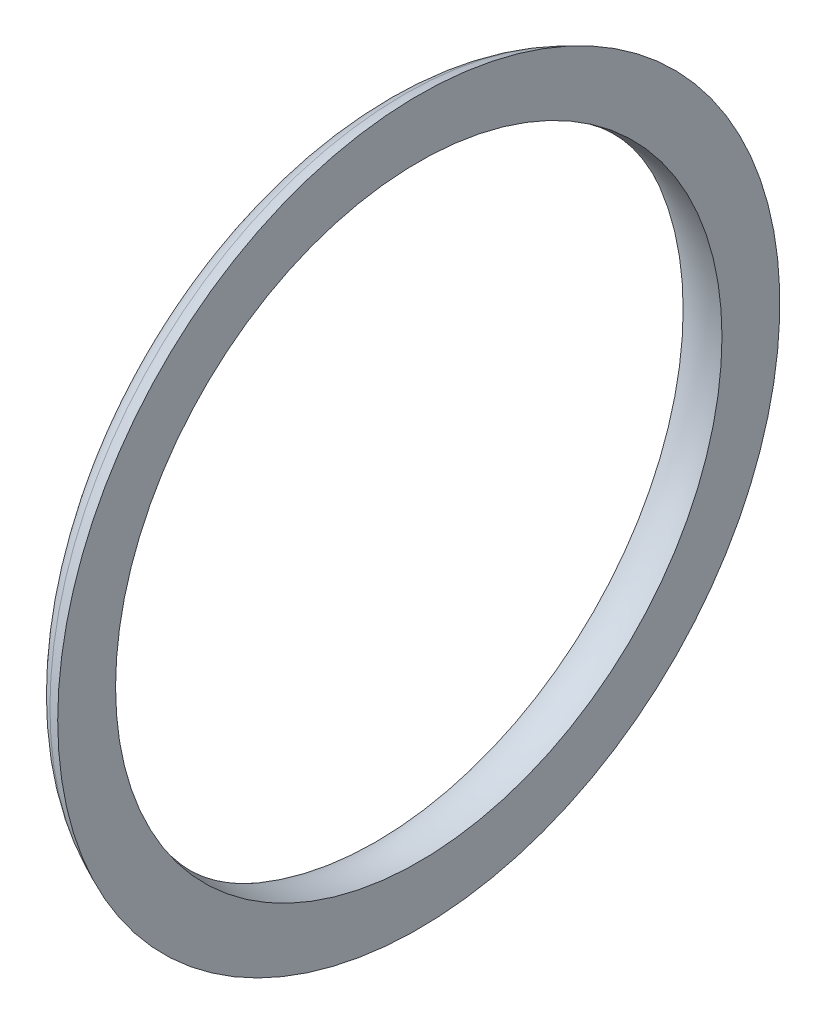
ISO-10303-21;
HEADER;
FILE_DESCRIPTION(('STEP AP214'),'2;1');
FILE_NAME('part.step','',(''),(''),'','','');
FILE_SCHEMA(('AUTOMOTIVE_DESIGN { 1 0 10303 214 1 1 1 1 }'));
ENDSEC;
DATA;
#1=APPLICATION_CONTEXT('core data for automotive mechanical design processes');
#2=APPLICATION_PROTOCOL_DEFINITION('international standard','automotive_design',2000,#1);
#3=PRODUCT_CONTEXT('',#1,'mechanical');
#4=PRODUCT('Part','Part','',(#3));
#5=PRODUCT_RELATED_PRODUCT_CATEGORY('part','',(#4));
#6=PRODUCT_DEFINITION_FORMATION('','',#4);
#7=PRODUCT_DEFINITION_CONTEXT('part definition',#1,'design');
#8=PRODUCT_DEFINITION('design','',#6,#7);
#9=PRODUCT_DEFINITION_SHAPE('','',#8);
#10=(LENGTH_UNIT() NAMED_UNIT(*) SI_UNIT(.MILLI.,.METRE.));
#11=(NAMED_UNIT(*) PLANE_ANGLE_UNIT() SI_UNIT($,.RADIAN.));
#12=(NAMED_UNIT(*) SI_UNIT($,.STERADIAN.) SOLID_ANGLE_UNIT());
#13=UNCERTAINTY_MEASURE_WITH_UNIT(LENGTH_MEASURE(1.E-05),#10,'distance_accuracy_value','');
#14=(GEOMETRIC_REPRESENTATION_CONTEXT(3) GLOBAL_UNCERTAINTY_ASSIGNED_CONTEXT((#13)) GLOBAL_UNIT_ASSIGNED_CONTEXT((#10,
#11,#12)) REPRESENTATION_CONTEXT('',''));
#15=CARTESIAN_POINT('',(0.,0.,0.));
#16=DIRECTION('',(0.,0.,1.));
#17=DIRECTION('',(1.,0.,0.));
#18=AXIS2_PLACEMENT_3D('',#15,#16,#17);
#19=CARTESIAN_POINT('',(-103.799772314073,19.4601331701569,0.));
#20=CARTESIAN_POINT('',(-129.180769059261,19.3560141965735,0.));
#21=CARTESIAN_POINT('',(-144.933963244161,17.4224067966165,0.));
#22=CARTESIAN_POINT('',(-153.060979648289,10.6606192839463,0.));
#23=CARTESIAN_POINT('',(-154.68552667526,9.30897419619385,0.));
#24=CARTESIAN_POINT('',(-156.310073702232,7.95732910844136,0.));
#25=CARTESIAN_POINT('',(-157.934620729204,6.60568402068888,0.));
#26=B_SPLINE_CURVE_WITH_KNOTS('',3,(#19,#20,#21,#22,#23,#24,#25),.UNSPECIFIED.,.F.,.F.,(4,3,4),
(0.,1.,1.19989464105753),.UNSPECIFIED.);
#27=CARTESIAN_POINT('',(-153.060979648289,-37.9379897826427,0.));
#28=DIRECTION('',(-1.,0.,0.));
#29=AXIS1_PLACEMENT('',#27,#28);
#30=SURFACE_OF_REVOLUTION('',#26,#29);
#31=CARTESIAN_POINT('',(-146.821930309254,-37.9379897826427,0.));
#32=DIRECTION('',(-1.,0.,0.));
#33=DIRECTION('',(0.,0.,1.));
#34=AXIS2_PLACEMENT_3D('',#31,#32,#33);
#35=CIRCLE('',#34,52.2863908629467);
#36=CARTESIAN_POINT('',(-146.821930309254,-37.9379897826427,52.2863908629467));
#37=VERTEX_POINT('',#36);
#38=EDGE_CURVE('E49',#37,#37,#35,.T.);
#39=ORIENTED_EDGE('',*,*,#38,.T.);
#40=EDGE_LOOP('',(#39));
#41=FACE_BOUND('',#40,.T.);
#42=CARTESIAN_POINT('',(-148.943697723337,-37.9379897826427,0.));
#43=DIRECTION('',(-1.,0.,0.));
#44=DIRECTION('',(0.,0.,1.));
#45=AXIS2_PLACEMENT_3D('',#42,#43,#44);
#46=CIRCLE('',#45,51.2939500138645);
#47=CARTESIAN_POINT('',(-148.943697723337,-37.9379897826427,51.2939500138645));
#48=VERTEX_POINT('',#47);
#49=EDGE_CURVE('E10',#48,#48,#46,.F.);
#50=ORIENTED_EDGE('',*,*,#49,.T.);
#51=EDGE_LOOP('',(#50));
#52=FACE_BOUND('',#51,.T.);
#53=ADVANCED_FACE('F37',(#41,#52),#30,.T.);
#54=CARTESIAN_POINT('',(-145.440979648289,-37.9379897826427,0.));
#55=DIRECTION('',(-1.,0.,0.));
#56=DIRECTION('',(0.,0.,1.));
#57=AXIS2_PLACEMENT_3D('',#54,#55,#56);
#58=TOROIDAL_SURFACE('',#57,44.5267226579432,7.62);
#59=ORIENTED_EDGE('',*,*,#49,.F.);
#60=EDGE_LOOP('',(#59));
#61=FACE_BOUND('',#60,.T.);
#62=CARTESIAN_POINT('',(-153.060979648289,-37.9379897826427,0.));
#63=DIRECTION('',(1.,0.,0.));
#64=DIRECTION('',(0.,0.,-1.));
#65=AXIS2_PLACEMENT_3D('',#62,#63,#64);
#66=CIRCLE('',#65,44.5267226579432);
#67=CARTESIAN_POINT('',(-153.060979648289,-37.9379897826427,-44.5267226579432));
#68=VERTEX_POINT('',#67);
#69=EDGE_CURVE('E45',#68,#68,#66,.F.);
#70=ORIENTED_EDGE('',*,*,#69,.F.);
#71=EDGE_LOOP('',(#70));
#72=FACE_BOUND('',#71,.T.);
#73=ADVANCED_FACE('F62',(#61,#72),#58,.T.);
#74=CARTESIAN_POINT('',(-149.25689383036,-37.9379897826427,0.));
#75=DIRECTION('',(-1.,0.,0.));
#76=DIRECTION('',(0.,0.,1.));
#77=AXIS2_PLACEMENT_3D('',#74,#75,#76);
#78=TOROIDAL_SURFACE('',#77,51.1292472576577,7.62);
#79=CARTESIAN_POINT('',(-146.821930309254,-37.9379897826427,0.));
#80=DIRECTION('',(1.,0.,0.));
#81=DIRECTION('',(0.,0.,-1.));
#82=AXIS2_PLACEMENT_3D('',#79,#80,#81);
#83=CIRCLE('',#82,43.908765788193);
#84=CARTESIAN_POINT('',(-146.821930309254,-37.9379897826427,-43.908765788193));
#85=VERTEX_POINT('',#84);
#86=EDGE_CURVE('E41',#85,#85,#83,.F.);
#87=ORIENTED_EDGE('',*,*,#86,.F.);
#88=EDGE_LOOP('',(#87));
#89=FACE_BOUND('',#88,.T.);
#90=ORIENTED_EDGE('',*,*,#69,.T.);
#91=EDGE_LOOP('',(#90));
#92=FACE_BOUND('',#91,.T.);
#93=ADVANCED_FACE('F39',(#89,#92),#78,.T.);
#94=CARTESIAN_POINT('',(-146.821930309254,-95.3361127354423,-65.7136496978419));
#95=DIRECTION('',(-1.,0.,0.));
#96=DIRECTION('',(0.,0.,1.));
#97=AXIS2_PLACEMENT_3D('',#94,#95,#96);
#98=PLANE('',#97);
#99=ORIENTED_EDGE('',*,*,#86,.T.);
#100=EDGE_LOOP('',(#99));
#101=FACE_BOUND('',#100,.T.);
#102=ORIENTED_EDGE('',*,*,#38,.F.);
#103=EDGE_LOOP('',(#102));
#104=FACE_BOUND('',#103,.T.);
#105=ADVANCED_FACE('F64',(#101,#104),#98,.F.);
#106=CLOSED_SHELL('',(#53,#73,#93,#105));
#107=MANIFOLD_SOLID_BREP('B2',#106);
#108=ADVANCED_BREP_SHAPE_REPRESENTATION('',(#18,#107),#14);
#109=SHAPE_DEFINITION_REPRESENTATION(#9,#108);
ENDSEC;
END-ISO-10303-21;
